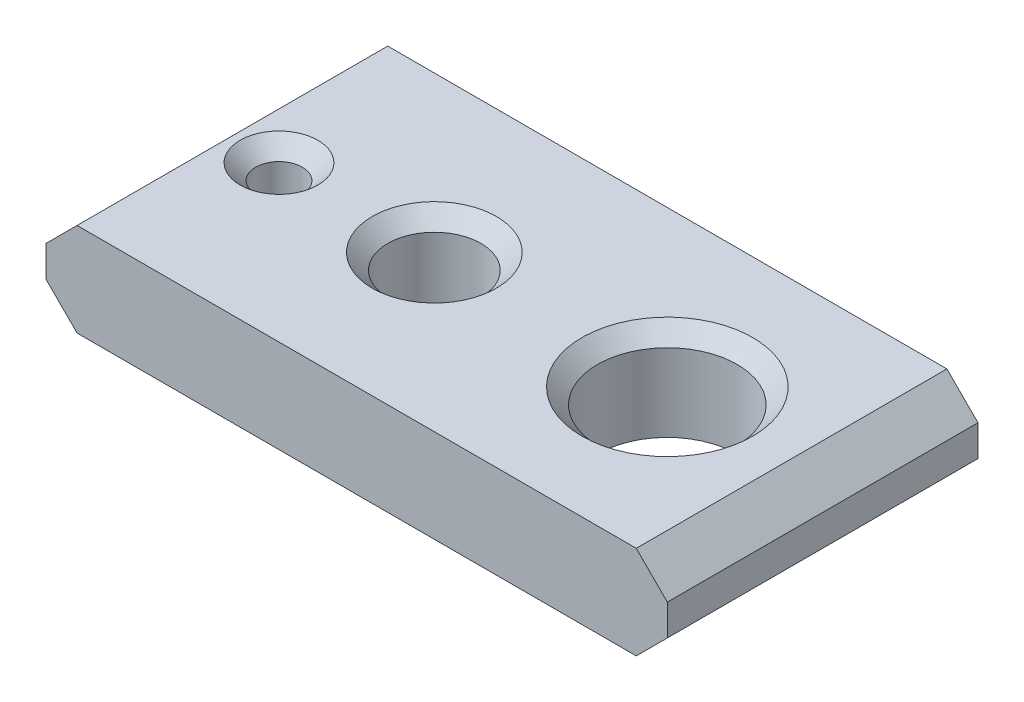
ISO-10303-21;
HEADER;
FILE_DESCRIPTION(('STEP AP214'),'2;1');
FILE_NAME('part.step','',(''),(''),'','','');
FILE_SCHEMA(('AUTOMOTIVE_DESIGN { 1 0 10303 214 1 1 1 1 }'));
ENDSEC;
DATA;
#1=APPLICATION_CONTEXT('core data for automotive mechanical design processes');
#2=APPLICATION_PROTOCOL_DEFINITION('international standard','automotive_design',2000,#1);
#3=PRODUCT_CONTEXT('',#1,'mechanical');
#4=PRODUCT('Part','Part','',(#3));
#5=PRODUCT_RELATED_PRODUCT_CATEGORY('part','',(#4));
#6=PRODUCT_DEFINITION_FORMATION('','',#4);
#7=PRODUCT_DEFINITION_CONTEXT('part definition',#1,'design');
#8=PRODUCT_DEFINITION('design','',#6,#7);
#9=PRODUCT_DEFINITION_SHAPE('','',#8);
#10=(LENGTH_UNIT() NAMED_UNIT(*) SI_UNIT(.MILLI.,.METRE.));
#11=(NAMED_UNIT(*) PLANE_ANGLE_UNIT() SI_UNIT($,.RADIAN.));
#12=(NAMED_UNIT(*) SI_UNIT($,.STERADIAN.) SOLID_ANGLE_UNIT());
#13=UNCERTAINTY_MEASURE_WITH_UNIT(LENGTH_MEASURE(1.E-05),#10,'distance_accuracy_value','');
#14=(GEOMETRIC_REPRESENTATION_CONTEXT(3) GLOBAL_UNCERTAINTY_ASSIGNED_CONTEXT((#13)) GLOBAL_UNIT_ASSIGNED_CONTEXT((#10,
#11,#12)) REPRESENTATION_CONTEXT('',''));
#15=CARTESIAN_POINT('',(0.,0.,0.));
#16=DIRECTION('',(0.,0.,1.));
#17=DIRECTION('',(1.,0.,0.));
#18=AXIS2_PLACEMENT_3D('',#15,#16,#17);
#19=CARTESIAN_POINT('',(190.,30.,-100.));
#20=DIRECTION('',(0.707106781186547,0.707106781186548,0.));
#21=DIRECTION('',(-0.707106781186548,0.707106781186547,0.));
#22=AXIS2_PLACEMENT_3D('',#19,#20,#21);
#23=PLANE('',#22);
#24=DIRECTION('',(-0.707106781186548,0.707106781186547,0.));
#25=VECTOR('',#24,1.);
#26=CARTESIAN_POINT('',(190.,30.,0.));
#27=LINE('',#26,#25);
#28=CARTESIAN_POINT('',(200.,20.,0.));
#29=VERTEX_POINT('',#28);
#30=CARTESIAN_POINT('',(190.,30.,0.));
#31=VERTEX_POINT('',#30);
#32=EDGE_CURVE('E148',#29,#31,#27,.T.);
#33=ORIENTED_EDGE('',*,*,#32,.F.);
#34=DIRECTION('',(0.,0.,1.));
#35=VECTOR('',#34,1.);
#36=CARTESIAN_POINT('',(200.,20.,-100.));
#37=LINE('',#36,#35);
#38=CARTESIAN_POINT('',(200.,20.,-100.));
#39=VERTEX_POINT('',#38);
#40=EDGE_CURVE('E60',#39,#29,#37,.T.);
#41=ORIENTED_EDGE('',*,*,#40,.F.);
#42=DIRECTION('',(-0.707106781186548,0.707106781186547,0.));
#43=VECTOR('',#42,1.);
#44=CARTESIAN_POINT('',(190.,30.,-100.));
#45=LINE('',#44,#43);
#46=CARTESIAN_POINT('',(190.,30.,-100.));
#47=VERTEX_POINT('',#46);
#48=EDGE_CURVE('E178',#39,#47,#45,.T.);
#49=ORIENTED_EDGE('',*,*,#48,.T.);
#50=DIRECTION('',(0.,0.,1.));
#51=VECTOR('',#50,1.);
#52=CARTESIAN_POINT('',(190.,30.,-100.));
#53=LINE('',#52,#51);
#54=EDGE_CURVE('E101',#47,#31,#53,.T.);
#55=ORIENTED_EDGE('',*,*,#54,.T.);
#56=EDGE_LOOP('',(#33,#41,#49,#55));
#57=FACE_BOUND('',#56,.T.);
#58=ADVANCED_FACE('F41',(#57),#23,.T.);
#59=CARTESIAN_POINT('',(200.,10.,-100.));
#60=DIRECTION('',(1.,0.,0.));
#61=DIRECTION('',(0.,0.,-1.));
#62=AXIS2_PLACEMENT_3D('',#59,#60,#61);
#63=PLANE('',#62);
#64=DIRECTION('',(0.,1.,0.));
#65=VECTOR('',#64,1.);
#66=CARTESIAN_POINT('',(200.,10.,0.));
#67=LINE('',#66,#65);
#68=CARTESIAN_POINT('',(200.,10.,0.));
#69=VERTEX_POINT('',#68);
#70=EDGE_CURVE('E174',#69,#29,#67,.T.);
#71=ORIENTED_EDGE('',*,*,#70,.F.);
#72=DIRECTION('',(0.,0.,1.));
#73=VECTOR('',#72,1.);
#74=CARTESIAN_POINT('',(200.,10.,-100.));
#75=LINE('',#74,#73);
#76=CARTESIAN_POINT('',(200.,10.,-100.));
#77=VERTEX_POINT('',#76);
#78=EDGE_CURVE('E89',#77,#69,#75,.T.);
#79=ORIENTED_EDGE('',*,*,#78,.F.);
#80=DIRECTION('',(0.,1.,0.));
#81=VECTOR('',#80,1.);
#82=CARTESIAN_POINT('',(200.,10.,-100.));
#83=LINE('',#82,#81);
#84=EDGE_CURVE('E134',#77,#39,#83,.T.);
#85=ORIENTED_EDGE('',*,*,#84,.T.);
#86=ORIENTED_EDGE('',*,*,#40,.T.);
#87=EDGE_LOOP('',(#71,#79,#85,#86));
#88=FACE_BOUND('',#87,.T.);
#89=ADVANCED_FACE('F232',(#88),#63,.T.);
#90=CARTESIAN_POINT('',(200.,10.,-100.));
#91=DIRECTION('',(0.707106781186547,-0.707106781186548,0.));
#92=DIRECTION('',(0.707106781186548,0.707106781186547,0.));
#93=AXIS2_PLACEMENT_3D('',#90,#91,#92);
#94=PLANE('',#93);
#95=DIRECTION('',(0.707106781186548,0.707106781186547,0.));
#96=VECTOR('',#95,1.);
#97=CARTESIAN_POINT('',(200.,10.,0.));
#98=LINE('',#97,#96);
#99=CARTESIAN_POINT('',(190.,0.,0.));
#100=VERTEX_POINT('',#99);
#101=EDGE_CURVE('E120',#100,#69,#98,.T.);
#102=ORIENTED_EDGE('',*,*,#101,.F.);
#103=DIRECTION('',(0.,0.,1.));
#104=VECTOR('',#103,1.);
#105=CARTESIAN_POINT('',(190.,0.,-100.));
#106=LINE('',#105,#104);
#107=CARTESIAN_POINT('',(190.,0.,-100.));
#108=VERTEX_POINT('',#107);
#109=EDGE_CURVE('E115',#108,#100,#106,.T.);
#110=ORIENTED_EDGE('',*,*,#109,.F.);
#111=DIRECTION('',(0.707106781186548,0.707106781186547,0.));
#112=VECTOR('',#111,1.);
#113=CARTESIAN_POINT('',(200.,10.,-100.));
#114=LINE('',#113,#112);
#115=EDGE_CURVE('E118',#108,#77,#114,.T.);
#116=ORIENTED_EDGE('',*,*,#115,.T.);
#117=ORIENTED_EDGE('',*,*,#78,.T.);
#118=EDGE_LOOP('',(#102,#110,#116,#117));
#119=FACE_BOUND('',#118,.T.);
#120=ADVANCED_FACE('F117',(#119),#94,.T.);
#121=CARTESIAN_POINT('',(190.,0.,-100.));
#122=DIRECTION('',(0.,-1.,0.));
#123=DIRECTION('',(1.,0.,0.));
#124=AXIS2_PLACEMENT_3D('',#121,#122,#123);
#125=PLANE('',#124);
#126=CARTESIAN_POINT('',(25.,0.,-50.));
#127=DIRECTION('',(0.,1.,0.));
#128=DIRECTION('',(0.,0.,1.));
#129=AXIS2_PLACEMENT_3D('',#126,#127,#128);
#130=CIRCLE('',#129,7.5);
#131=CARTESIAN_POINT('',(25.,0.,-42.5));
#132=VERTEX_POINT('',#131);
#133=EDGE_CURVE('E153',#132,#132,#130,.T.);
#134=ORIENTED_EDGE('',*,*,#133,.T.);
#135=EDGE_LOOP('',(#134));
#136=FACE_BOUND('',#135,.T.);
#137=CARTESIAN_POINT('',(75.,0.,-50.));
#138=DIRECTION('',(0.,1.,0.));
#139=DIRECTION('',(0.,0.,1.));
#140=AXIS2_PLACEMENT_3D('',#137,#138,#139);
#141=CIRCLE('',#140,15.);
#142=CARTESIAN_POINT('',(75.,0.,-35.));
#143=VERTEX_POINT('',#142);
#144=EDGE_CURVE('E378',#143,#143,#141,.T.);
#145=ORIENTED_EDGE('',*,*,#144,.T.);
#146=EDGE_LOOP('',(#145));
#147=FACE_BOUND('',#146,.T.);
#148=CARTESIAN_POINT('',(150.,0.,-50.));
#149=DIRECTION('',(0.,1.,0.));
#150=DIRECTION('',(0.,0.,1.));
#151=AXIS2_PLACEMENT_3D('',#148,#149,#150);
#152=CIRCLE('',#151,22.5);
#153=CARTESIAN_POINT('',(150.,0.,-27.5));
#154=VERTEX_POINT('',#153);
#155=EDGE_CURVE('E381',#154,#154,#152,.T.);
#156=ORIENTED_EDGE('',*,*,#155,.T.);
#157=EDGE_LOOP('',(#156));
#158=FACE_BOUND('',#157,.T.);
#159=DIRECTION('',(1.,0.,0.));
#160=VECTOR('',#159,1.);
#161=CARTESIAN_POINT('',(190.,0.,0.));
#162=LINE('',#161,#160);
#163=CARTESIAN_POINT('',(10.,0.,0.));
#164=VERTEX_POINT('',#163);
#165=EDGE_CURVE('E169',#164,#100,#162,.T.);
#166=ORIENTED_EDGE('',*,*,#165,.F.);
#167=DIRECTION('',(0.,0.,1.));
#168=VECTOR('',#167,1.);
#169=CARTESIAN_POINT('',(10.,0.,-100.));
#170=LINE('',#169,#168);
#171=CARTESIAN_POINT('',(10.,0.,-100.));
#172=VERTEX_POINT('',#171);
#173=EDGE_CURVE('E126',#172,#164,#170,.T.);
#174=ORIENTED_EDGE('',*,*,#173,.F.);
#175=DIRECTION('',(1.,0.,0.));
#176=VECTOR('',#175,1.);
#177=CARTESIAN_POINT('',(190.,0.,-100.));
#178=LINE('',#177,#176);
#179=EDGE_CURVE('E132',#172,#108,#178,.T.);
#180=ORIENTED_EDGE('',*,*,#179,.T.);
#181=ORIENTED_EDGE('',*,*,#109,.T.);
#182=EDGE_LOOP('',(#166,#174,#180,#181));
#183=FACE_BOUND('',#182,.T.);
#184=ADVANCED_FACE('F137',(#136,#147,#158,#183),#125,.T.);
#185=CARTESIAN_POINT('',(10.,0.,-100.));
#186=DIRECTION('',(-0.707106781186548,-0.707106781186548,0.));
#187=DIRECTION('',(0.707106781186548,-0.707106781186548,0.));
#188=AXIS2_PLACEMENT_3D('',#185,#186,#187);
#189=PLANE('',#188);
#190=DIRECTION('',(0.707106781186548,-0.707106781186548,0.));
#191=VECTOR('',#190,1.);
#192=CARTESIAN_POINT('',(10.,0.,0.));
#193=LINE('',#192,#191);
#194=CARTESIAN_POINT('',(0.,10.,0.));
#195=VERTEX_POINT('',#194);
#196=EDGE_CURVE('E165',#195,#164,#193,.T.);
#197=ORIENTED_EDGE('',*,*,#196,.F.);
#198=DIRECTION('',(0.,0.,1.));
#199=VECTOR('',#198,1.);
#200=CARTESIAN_POINT('',(0.,10.,-100.));
#201=LINE('',#200,#199);
#202=CARTESIAN_POINT('',(0.,10.,-100.));
#203=VERTEX_POINT('',#202);
#204=EDGE_CURVE('E186',#203,#195,#201,.T.);
#205=ORIENTED_EDGE('',*,*,#204,.F.);
#206=DIRECTION('',(0.707106781186548,-0.707106781186548,0.));
#207=VECTOR('',#206,1.);
#208=CARTESIAN_POINT('',(10.,0.,-100.));
#209=LINE('',#208,#207);
#210=EDGE_CURVE('E139',#203,#172,#209,.T.);
#211=ORIENTED_EDGE('',*,*,#210,.T.);
#212=ORIENTED_EDGE('',*,*,#173,.T.);
#213=EDGE_LOOP('',(#197,#205,#211,#212));
#214=FACE_BOUND('',#213,.T.);
#215=ADVANCED_FACE('F257',(#214),#189,.T.);
#216=CARTESIAN_POINT('',(0.,10.,-100.));
#217=DIRECTION('',(-1.,0.,0.));
#218=DIRECTION('',(0.,0.,1.));
#219=AXIS2_PLACEMENT_3D('',#216,#217,#218);
#220=PLANE('',#219);
#221=DIRECTION('',(0.,-1.,0.));
#222=VECTOR('',#221,1.);
#223=CARTESIAN_POINT('',(0.,10.,0.));
#224=LINE('',#223,#222);
#225=CARTESIAN_POINT('',(0.,20.,0.));
#226=VERTEX_POINT('',#225);
#227=EDGE_CURVE('E161',#226,#195,#224,.T.);
#228=ORIENTED_EDGE('',*,*,#227,.F.);
#229=DIRECTION('',(0.,0.,1.));
#230=VECTOR('',#229,1.);
#231=CARTESIAN_POINT('',(0.,20.,-100.));
#232=LINE('',#231,#230);
#233=CARTESIAN_POINT('',(0.,20.,-100.));
#234=VERTEX_POINT('',#233);
#235=EDGE_CURVE('E189',#234,#226,#232,.T.);
#236=ORIENTED_EDGE('',*,*,#235,.F.);
#237=DIRECTION('',(0.,-1.,0.));
#238=VECTOR('',#237,1.);
#239=CARTESIAN_POINT('',(0.,10.,-100.));
#240=LINE('',#239,#238);
#241=EDGE_CURVE('E142',#234,#203,#240,.T.);
#242=ORIENTED_EDGE('',*,*,#241,.T.);
#243=ORIENTED_EDGE('',*,*,#204,.T.);
#244=EDGE_LOOP('',(#228,#236,#242,#243));
#245=FACE_BOUND('',#244,.T.);
#246=ADVANCED_FACE('F253',(#245),#220,.T.);
#247=CARTESIAN_POINT('',(0.,20.,-100.));
#248=DIRECTION('',(-0.707106781186548,0.707106781186547,0.));
#249=DIRECTION('',(-0.707106781186547,-0.707106781186548,0.));
#250=AXIS2_PLACEMENT_3D('',#247,#248,#249);
#251=PLANE('',#250);
#252=DIRECTION('',(-0.707106781186547,-0.707106781186548,0.));
#253=VECTOR('',#252,1.);
#254=CARTESIAN_POINT('',(0.,20.,0.));
#255=LINE('',#254,#253);
#256=CARTESIAN_POINT('',(10.,30.,0.));
#257=VERTEX_POINT('',#256);
#258=EDGE_CURVE('E157',#257,#226,#255,.T.);
#259=ORIENTED_EDGE('',*,*,#258,.F.);
#260=DIRECTION('',(0.,0.,1.));
#261=VECTOR('',#260,1.);
#262=CARTESIAN_POINT('',(10.,30.,-100.));
#263=LINE('',#262,#261);
#264=CARTESIAN_POINT('',(10.,30.,-100.));
#265=VERTEX_POINT('',#264);
#266=EDGE_CURVE('E192',#265,#257,#263,.T.);
#267=ORIENTED_EDGE('',*,*,#266,.F.);
#268=DIRECTION('',(-0.707106781186547,-0.707106781186548,0.));
#269=VECTOR('',#268,1.);
#270=CARTESIAN_POINT('',(0.,20.,-100.));
#271=LINE('',#270,#269);
#272=EDGE_CURVE('E395',#265,#234,#271,.T.);
#273=ORIENTED_EDGE('',*,*,#272,.T.);
#274=ORIENTED_EDGE('',*,*,#235,.T.);
#275=EDGE_LOOP('',(#259,#267,#273,#274));
#276=FACE_BOUND('',#275,.T.);
#277=ADVANCED_FACE('F249',(#276),#251,.T.);
#278=CARTESIAN_POINT('',(10.,30.,-100.));
#279=DIRECTION('',(0.,1.,0.));
#280=DIRECTION('',(0.,0.,1.));
#281=AXIS2_PLACEMENT_3D('',#278,#279,#280);
#282=PLANE('',#281);
#283=CARTESIAN_POINT('',(150.,30.,-50.));
#284=DIRECTION('',(0.,1.,0.));
#285=DIRECTION('',(0.,0.,1.));
#286=AXIS2_PLACEMENT_3D('',#283,#284,#285);
#287=CIRCLE('',#286,27.5);
#288=CARTESIAN_POINT('',(150.,30.,-22.5));
#289=VERTEX_POINT('',#288);
#290=EDGE_CURVE('E208',#289,#289,#287,.F.);
#291=ORIENTED_EDGE('',*,*,#290,.T.);
#292=EDGE_LOOP('',(#291));
#293=FACE_BOUND('',#292,.T.);
#294=CARTESIAN_POINT('',(25.,30.,-50.));
#295=DIRECTION('',(0.,1.,0.));
#296=DIRECTION('',(0.,0.,1.));
#297=AXIS2_PLACEMENT_3D('',#294,#295,#296);
#298=CIRCLE('',#297,12.5);
#299=CARTESIAN_POINT('',(25.,30.,-37.5));
#300=VERTEX_POINT('',#299);
#301=EDGE_CURVE('E204',#300,#300,#298,.F.);
#302=ORIENTED_EDGE('',*,*,#301,.T.);
#303=EDGE_LOOP('',(#302));
#304=FACE_BOUND('',#303,.T.);
#305=CARTESIAN_POINT('',(75.,30.,-50.));
#306=DIRECTION('',(0.,1.,0.));
#307=DIRECTION('',(0.,0.,1.));
#308=AXIS2_PLACEMENT_3D('',#305,#306,#307);
#309=CIRCLE('',#308,20.);
#310=CARTESIAN_POINT('',(75.,30.,-30.));
#311=VERTEX_POINT('',#310);
#312=EDGE_CURVE('E200',#311,#311,#309,.F.);
#313=ORIENTED_EDGE('',*,*,#312,.T.);
#314=EDGE_LOOP('',(#313));
#315=FACE_BOUND('',#314,.T.);
#316=DIRECTION('',(-1.,0.,0.));
#317=VECTOR('',#316,1.);
#318=CARTESIAN_POINT('',(10.,30.,0.));
#319=LINE('',#318,#317);
#320=EDGE_CURVE('E152',#31,#257,#319,.T.);
#321=ORIENTED_EDGE('',*,*,#320,.F.);
#322=ORIENTED_EDGE('',*,*,#54,.F.);
#323=DIRECTION('',(-1.,0.,0.));
#324=VECTOR('',#323,1.);
#325=CARTESIAN_POINT('',(10.,30.,-100.));
#326=LINE('',#325,#324);
#327=EDGE_CURVE('E392',#47,#265,#326,.T.);
#328=ORIENTED_EDGE('',*,*,#327,.T.);
#329=ORIENTED_EDGE('',*,*,#266,.T.);
#330=EDGE_LOOP('',(#321,#322,#328,#329));
#331=FACE_BOUND('',#330,.T.);
#332=ADVANCED_FACE('F239',(#293,#304,#315,#331),#282,.T.);
#333=CARTESIAN_POINT('',(0.,0.,-100.));
#334=DIRECTION('',(0.,0.,-1.));
#335=DIRECTION('',(-1.,0.,0.));
#336=AXIS2_PLACEMENT_3D('',#333,#334,#335);
#337=PLANE('',#336);
#338=ORIENTED_EDGE('',*,*,#48,.F.);
#339=ORIENTED_EDGE('',*,*,#84,.F.);
#340=ORIENTED_EDGE('',*,*,#115,.F.);
#341=ORIENTED_EDGE('',*,*,#179,.F.);
#342=ORIENTED_EDGE('',*,*,#210,.F.);
#343=ORIENTED_EDGE('',*,*,#241,.F.);
#344=ORIENTED_EDGE('',*,*,#272,.F.);
#345=ORIENTED_EDGE('',*,*,#327,.F.);
#346=EDGE_LOOP('',(#338,#339,#340,#341,#342,#343,#344,#345));
#347=FACE_BOUND('',#346,.T.);
#348=ADVANCED_FACE('F130',(#347),#337,.T.);
#349=CARTESIAN_POINT('',(0.,0.,0.));
#350=DIRECTION('',(0.,0.,-1.));
#351=DIRECTION('',(-1.,0.,0.));
#352=AXIS2_PLACEMENT_3D('',#349,#350,#351);
#353=PLANE('',#352);
#354=ORIENTED_EDGE('',*,*,#32,.T.);
#355=ORIENTED_EDGE('',*,*,#320,.T.);
#356=ORIENTED_EDGE('',*,*,#258,.T.);
#357=ORIENTED_EDGE('',*,*,#227,.T.);
#358=ORIENTED_EDGE('',*,*,#196,.T.);
#359=ORIENTED_EDGE('',*,*,#165,.T.);
#360=ORIENTED_EDGE('',*,*,#101,.T.);
#361=ORIENTED_EDGE('',*,*,#70,.T.);
#362=EDGE_LOOP('',(#354,#355,#356,#357,#358,#359,#360,#361));
#363=FACE_BOUND('',#362,.T.);
#364=ADVANCED_FACE('F267',(#363),#353,.F.);
#365=CARTESIAN_POINT('',(150.,0.,-50.));
#366=DIRECTION('',(0.,1.,0.));
#367=DIRECTION('',(0.,0.,1.));
#368=AXIS2_PLACEMENT_3D('',#365,#366,#367);
#369=CYLINDRICAL_SURFACE('',#368,22.5);
#370=CARTESIAN_POINT('',(150.,24.9999999999999,-50.));
#371=DIRECTION('',(0.,1.,0.));
#372=DIRECTION('',(0.,0.,1.));
#373=AXIS2_PLACEMENT_3D('',#370,#371,#372);
#374=CIRCLE('',#373,22.5);
#375=CARTESIAN_POINT('',(150.,24.9999999999999,-27.5));
#376=VERTEX_POINT('',#375);
#377=EDGE_CURVE('E181',#376,#376,#374,.T.);
#378=ORIENTED_EDGE('',*,*,#377,.T.);
#379=EDGE_LOOP('',(#378));
#380=FACE_BOUND('',#379,.T.);
#381=ORIENTED_EDGE('',*,*,#155,.F.);
#382=EDGE_LOOP('',(#381));
#383=FACE_BOUND('',#382,.T.);
#384=ADVANCED_FACE('F270',(#380,#383),#369,.F.);
#385=CARTESIAN_POINT('',(75.,0.,-50.));
#386=DIRECTION('',(0.,1.,0.));
#387=DIRECTION('',(0.,0.,1.));
#388=AXIS2_PLACEMENT_3D('',#385,#386,#387);
#389=CYLINDRICAL_SURFACE('',#388,15.);
#390=CARTESIAN_POINT('',(75.,25.,-50.));
#391=DIRECTION('',(0.,1.,0.));
#392=DIRECTION('',(0.,0.,1.));
#393=AXIS2_PLACEMENT_3D('',#390,#391,#392);
#394=CIRCLE('',#393,15.);
#395=CARTESIAN_POINT('',(75.,25.,-35.));
#396=VERTEX_POINT('',#395);
#397=EDGE_CURVE('E11',#396,#396,#394,.T.);
#398=ORIENTED_EDGE('',*,*,#397,.T.);
#399=EDGE_LOOP('',(#398));
#400=FACE_BOUND('',#399,.T.);
#401=ORIENTED_EDGE('',*,*,#144,.F.);
#402=EDGE_LOOP('',(#401));
#403=FACE_BOUND('',#402,.T.);
#404=ADVANCED_FACE('F276',(#400,#403),#389,.F.);
#405=CARTESIAN_POINT('',(25.,0.,-50.));
#406=DIRECTION('',(0.,1.,0.));
#407=DIRECTION('',(0.,0.,1.));
#408=AXIS2_PLACEMENT_3D('',#405,#406,#407);
#409=CYLINDRICAL_SURFACE('',#408,7.5);
#410=CARTESIAN_POINT('',(25.,25.,-50.));
#411=DIRECTION('',(0.,1.,0.));
#412=DIRECTION('',(0.,0.,1.));
#413=AXIS2_PLACEMENT_3D('',#410,#411,#412);
#414=CIRCLE('',#413,7.5);
#415=CARTESIAN_POINT('',(25.,25.,-42.5));
#416=VERTEX_POINT('',#415);
#417=EDGE_CURVE('E52',#416,#416,#414,.T.);
#418=ORIENTED_EDGE('',*,*,#417,.T.);
#419=EDGE_LOOP('',(#418));
#420=FACE_BOUND('',#419,.T.);
#421=ORIENTED_EDGE('',*,*,#133,.F.);
#422=EDGE_LOOP('',(#421));
#423=FACE_BOUND('',#422,.T.);
#424=ADVANCED_FACE('F215',(#420,#423),#409,.F.);
#425=CARTESIAN_POINT('',(150.,24.9999999999999,-50.));
#426=DIRECTION('',(0.,1.,0.));
#427=DIRECTION('',(0.,0.,1.));
#428=AXIS2_PLACEMENT_3D('',#425,#426,#427);
#429=CONICAL_SURFACE('',#428,22.5,0.785398163397449);
#430=ORIENTED_EDGE('',*,*,#290,.F.);
#431=EDGE_LOOP('',(#430));
#432=FACE_BOUND('',#431,.T.);
#433=ORIENTED_EDGE('',*,*,#377,.F.);
#434=EDGE_LOOP('',(#433));
#435=FACE_BOUND('',#434,.T.);
#436=ADVANCED_FACE('F220',(#432,#435),#429,.F.);
#437=CARTESIAN_POINT('',(25.,25.,-50.));
#438=DIRECTION('',(0.,1.,0.));
#439=DIRECTION('',(0.,0.,1.));
#440=AXIS2_PLACEMENT_3D('',#437,#438,#439);
#441=CONICAL_SURFACE('',#440,7.5,0.785398163397448);
#442=ORIENTED_EDGE('',*,*,#301,.F.);
#443=EDGE_LOOP('',(#442));
#444=FACE_BOUND('',#443,.T.);
#445=ORIENTED_EDGE('',*,*,#417,.F.);
#446=EDGE_LOOP('',(#445));
#447=FACE_BOUND('',#446,.T.);
#448=ADVANCED_FACE('F218',(#444,#447),#441,.F.);
#449=CARTESIAN_POINT('',(75.,25.,-50.));
#450=DIRECTION('',(0.,1.,0.));
#451=DIRECTION('',(0.,0.,1.));
#452=AXIS2_PLACEMENT_3D('',#449,#450,#451);
#453=CONICAL_SURFACE('',#452,15.,0.785398163397449);
#454=ORIENTED_EDGE('',*,*,#312,.F.);
#455=EDGE_LOOP('',(#454));
#456=FACE_BOUND('',#455,.T.);
#457=ORIENTED_EDGE('',*,*,#397,.F.);
#458=EDGE_LOOP('',(#457));
#459=FACE_BOUND('',#458,.T.);
#460=ADVANCED_FACE('F44',(#456,#459),#453,.F.);
#461=CLOSED_SHELL('',(#58,#89,#120,#184,#215,#246,#277,#332,#348,#364,#384,#404,#424,#436,#448,#460));
#462=MANIFOLD_SOLID_BREP('B2',#461);
#463=ADVANCED_BREP_SHAPE_REPRESENTATION('',(#18,#462),#14);
#464=SHAPE_DEFINITION_REPRESENTATION(#9,#463);
ENDSEC;
END-ISO-10303-21;
